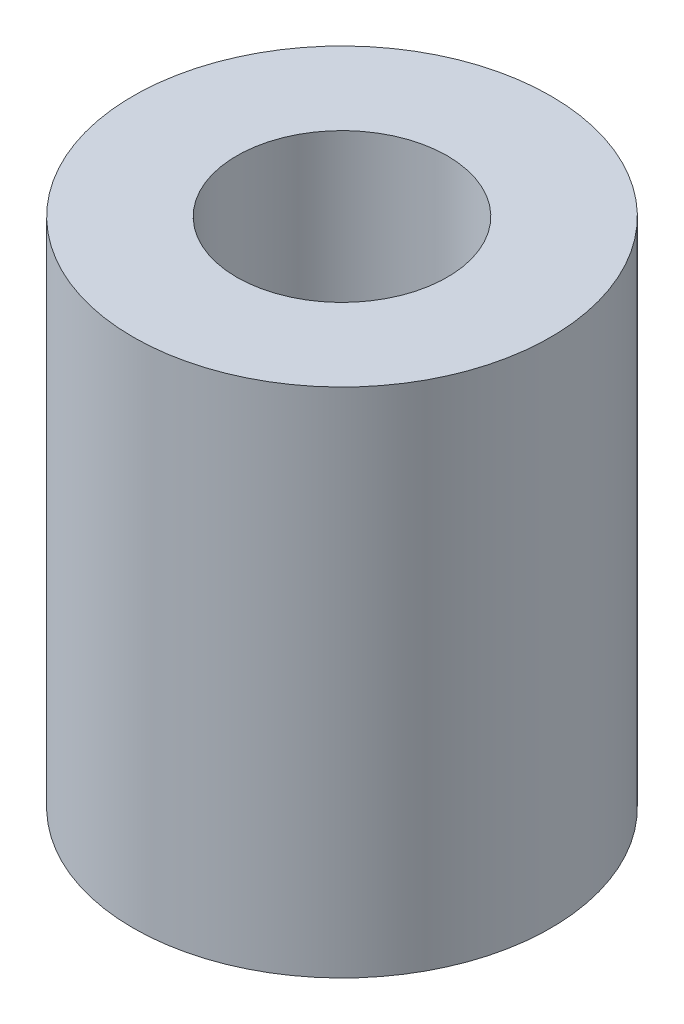
ISO-10303-21;
HEADER;
FILE_DESCRIPTION(('STEP AP214'),'2;1');
FILE_NAME('part.step','',(''),(''),'','','');
FILE_SCHEMA(('AUTOMOTIVE_DESIGN { 1 0 10303 214 1 1 1 1 }'));
ENDSEC;
DATA;
#1=APPLICATION_CONTEXT('core data for automotive mechanical design processes');
#2=APPLICATION_PROTOCOL_DEFINITION('international standard','automotive_design',2000,#1);
#3=PRODUCT_CONTEXT('',#1,'mechanical');
#4=PRODUCT('Part','Part','',(#3));
#5=PRODUCT_RELATED_PRODUCT_CATEGORY('part','',(#4));
#6=PRODUCT_DEFINITION_FORMATION('','',#4);
#7=PRODUCT_DEFINITION_CONTEXT('part definition',#1,'design');
#8=PRODUCT_DEFINITION('design','',#6,#7);
#9=PRODUCT_DEFINITION_SHAPE('','',#8);
#10=(LENGTH_UNIT() NAMED_UNIT(*) SI_UNIT(.MILLI.,.METRE.));
#11=(NAMED_UNIT(*) PLANE_ANGLE_UNIT() SI_UNIT($,.RADIAN.));
#12=(NAMED_UNIT(*) SI_UNIT($,.STERADIAN.) SOLID_ANGLE_UNIT());
#13=UNCERTAINTY_MEASURE_WITH_UNIT(LENGTH_MEASURE(1.E-05),#10,'distance_accuracy_value','');
#14=(GEOMETRIC_REPRESENTATION_CONTEXT(3) GLOBAL_UNCERTAINTY_ASSIGNED_CONTEXT((#13)) GLOBAL_UNIT_ASSIGNED_CONTEXT((#10,
#11,#12)) REPRESENTATION_CONTEXT('',''));
#15=CARTESIAN_POINT('',(0.,0.,0.));
#16=DIRECTION('',(0.,0.,1.));
#17=DIRECTION('',(1.,0.,0.));
#18=AXIS2_PLACEMENT_3D('',#15,#16,#17);
#19=CARTESIAN_POINT('',(0.,19.45,0.));
#20=DIRECTION('',(0.,-1.,0.));
#21=DIRECTION('',(0.,0.,-1.));
#22=AXIS2_PLACEMENT_3D('',#19,#20,#21);
#23=CYLINDRICAL_SURFACE('',#22,7.9375);
#24=CARTESIAN_POINT('',(0.,19.45,0.));
#25=DIRECTION('',(0.,1.,0.));
#26=DIRECTION('',(0.,0.,1.));
#27=AXIS2_PLACEMENT_3D('',#24,#25,#26);
#28=CIRCLE('',#27,7.9375);
#29=CARTESIAN_POINT('',(0.,19.45,7.9375));
#30=VERTEX_POINT('',#29);
#31=EDGE_CURVE('E10',#30,#30,#28,.T.);
#32=ORIENTED_EDGE('',*,*,#31,.F.);
#33=EDGE_LOOP('',(#32));
#34=FACE_BOUND('',#33,.T.);
#35=CARTESIAN_POINT('',(0.,0.,0.));
#36=DIRECTION('',(0.,1.,0.));
#37=DIRECTION('',(0.,0.,1.));
#38=AXIS2_PLACEMENT_3D('',#35,#36,#37);
#39=CIRCLE('',#38,7.9375);
#40=CARTESIAN_POINT('',(0.,0.,7.9375));
#41=VERTEX_POINT('',#40);
#42=EDGE_CURVE('E46',#41,#41,#39,.T.);
#43=ORIENTED_EDGE('',*,*,#42,.T.);
#44=EDGE_LOOP('',(#43));
#45=FACE_BOUND('',#44,.T.);
#46=ADVANCED_FACE('F43',(#34,#45),#23,.T.);
#47=CARTESIAN_POINT('',(0.,19.45,0.));
#48=DIRECTION('',(0.,1.,0.));
#49=DIRECTION('',(0.,0.,1.));
#50=AXIS2_PLACEMENT_3D('',#47,#48,#49);
#51=PLANE('',#50);
#52=CARTESIAN_POINT('',(0.,19.45,0.));
#53=DIRECTION('',(0.,1.,0.));
#54=DIRECTION('',(0.,0.,1.));
#55=AXIS2_PLACEMENT_3D('',#52,#53,#54);
#56=CIRCLE('',#55,4.);
#57=CARTESIAN_POINT('',(0.,19.45,4.));
#58=VERTEX_POINT('',#57);
#59=EDGE_CURVE('E57',#58,#58,#56,.T.);
#60=ORIENTED_EDGE('',*,*,#59,.F.);
#61=EDGE_LOOP('',(#60));
#62=FACE_BOUND('',#61,.T.);
#63=ORIENTED_EDGE('',*,*,#31,.T.);
#64=EDGE_LOOP('',(#63));
#65=FACE_BOUND('',#64,.T.);
#66=ADVANCED_FACE('F74',(#62,#65),#51,.T.);
#67=CARTESIAN_POINT('',(0.,0.,0.));
#68=DIRECTION('',(0.,1.,0.));
#69=DIRECTION('',(0.,0.,1.));
#70=AXIS2_PLACEMENT_3D('',#67,#68,#69);
#71=PLANE('',#70);
#72=CARTESIAN_POINT('',(0.,0.,0.));
#73=DIRECTION('',(0.,1.,0.));
#74=DIRECTION('',(0.,0.,1.));
#75=AXIS2_PLACEMENT_3D('',#72,#73,#74);
#76=CIRCLE('',#75,4.);
#77=CARTESIAN_POINT('',(0.,0.,4.));
#78=VERTEX_POINT('',#77);
#79=EDGE_CURVE('E55',#78,#78,#76,.T.);
#80=ORIENTED_EDGE('',*,*,#79,.T.);
#81=EDGE_LOOP('',(#80));
#82=FACE_BOUND('',#81,.T.);
#83=ORIENTED_EDGE('',*,*,#42,.F.);
#84=EDGE_LOOP('',(#83));
#85=FACE_BOUND('',#84,.T.);
#86=ADVANCED_FACE('F65',(#82,#85),#71,.F.);
#87=CARTESIAN_POINT('',(0.,0.,0.));
#88=DIRECTION('',(0.,1.,0.));
#89=DIRECTION('',(0.,0.,1.));
#90=AXIS2_PLACEMENT_3D('',#87,#88,#89);
#91=CYLINDRICAL_SURFACE('',#90,4.);
#92=ORIENTED_EDGE('',*,*,#79,.F.);
#93=EDGE_LOOP('',(#92));
#94=FACE_BOUND('',#93,.T.);
#95=ORIENTED_EDGE('',*,*,#59,.T.);
#96=EDGE_LOOP('',(#95));
#97=FACE_BOUND('',#96,.T.);
#98=ADVANCED_FACE('F68',(#94,#97),#91,.F.);
#99=CLOSED_SHELL('',(#46,#66,#86,#98));
#100=MANIFOLD_SOLID_BREP('B2',#99);
#101=ADVANCED_BREP_SHAPE_REPRESENTATION('',(#18,#100),#14);
#102=SHAPE_DEFINITION_REPRESENTATION(#9,#101);
ENDSEC;
END-ISO-10303-21;
